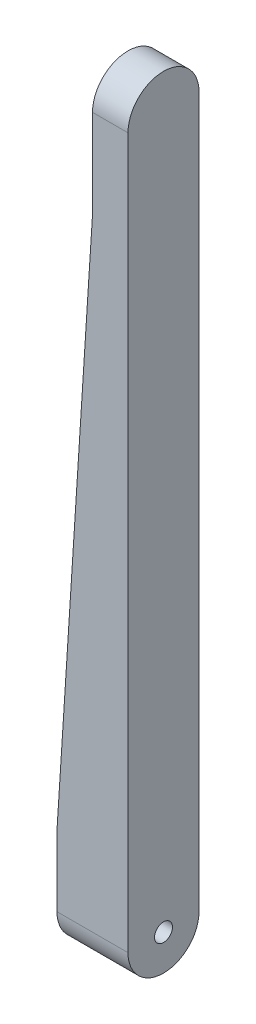
ISO-10303-21;
HEADER;
FILE_DESCRIPTION(('STEP AP214'),'2;1');
FILE_NAME('part.step','',(''),(''),'','','');
FILE_SCHEMA(('AUTOMOTIVE_DESIGN { 1 0 10303 214 1 1 1 1 }'));
ENDSEC;
DATA;
#1=APPLICATION_CONTEXT('core data for automotive mechanical design processes');
#2=APPLICATION_PROTOCOL_DEFINITION('international standard','automotive_design',2000,#1);
#3=PRODUCT_CONTEXT('',#1,'mechanical');
#4=PRODUCT('Part','Part','',(#3));
#5=PRODUCT_RELATED_PRODUCT_CATEGORY('part','',(#4));
#6=PRODUCT_DEFINITION_FORMATION('','',#4);
#7=PRODUCT_DEFINITION_CONTEXT('part definition',#1,'design');
#8=PRODUCT_DEFINITION('design','',#6,#7);
#9=PRODUCT_DEFINITION_SHAPE('','',#8);
#10=(LENGTH_UNIT() NAMED_UNIT(*) SI_UNIT(.MILLI.,.METRE.));
#11=(NAMED_UNIT(*) PLANE_ANGLE_UNIT() SI_UNIT($,.RADIAN.));
#12=(NAMED_UNIT(*) SI_UNIT($,.STERADIAN.) SOLID_ANGLE_UNIT());
#13=UNCERTAINTY_MEASURE_WITH_UNIT(LENGTH_MEASURE(1.E-05),#10,'distance_accuracy_value','');
#14=(GEOMETRIC_REPRESENTATION_CONTEXT(3) GLOBAL_UNCERTAINTY_ASSIGNED_CONTEXT((#13)) GLOBAL_UNIT_ASSIGNED_CONTEXT((#10,
#11,#12)) REPRESENTATION_CONTEXT('',''));
#15=CARTESIAN_POINT('',(0.,0.,0.));
#16=DIRECTION('',(0.,0.,1.));
#17=DIRECTION('',(1.,0.,0.));
#18=AXIS2_PLACEMENT_3D('',#15,#16,#17);
#19=CARTESIAN_POINT('',(9.99999999999999,438.,0.));
#20=DIRECTION('',(1.,0.,0.));
#21=DIRECTION('',(0.,0.,-1.));
#22=AXIS2_PLACEMENT_3D('',#19,#20,#21);
#23=CYLINDRICAL_SURFACE('',#22,20.);
#24=DIRECTION('',(1.,0.,0.));
#25=VECTOR('',#24,1.);
#26=CARTESIAN_POINT('',(20.,438.,20.));
#27=LINE('',#26,#25);
#28=CARTESIAN_POINT('',(20.,438.,20.));
#29=VERTEX_POINT('',#28);
#30=CARTESIAN_POINT('',(60.,438.,20.));
#31=VERTEX_POINT('',#30);
#32=EDGE_CURVE('E87',#29,#31,#27,.T.);
#33=ORIENTED_EDGE('',*,*,#32,.F.);
#34=CARTESIAN_POINT('',(20.,438.,0.));
#35=DIRECTION('',(-1.,0.,0.));
#36=DIRECTION('',(0.,0.,1.));
#37=AXIS2_PLACEMENT_3D('',#34,#35,#36);
#38=CIRCLE('',#37,20.);
#39=CARTESIAN_POINT('',(20.,438.,-20.));
#40=VERTEX_POINT('',#39);
#41=EDGE_CURVE('E91',#29,#40,#38,.F.);
#42=ORIENTED_EDGE('',*,*,#41,.T.);
#43=DIRECTION('',(1.,0.,0.));
#44=VECTOR('',#43,1.);
#45=CARTESIAN_POINT('',(20.,438.,-20.));
#46=LINE('',#45,#44);
#47=CARTESIAN_POINT('',(60.,438.,-20.));
#48=VERTEX_POINT('',#47);
#49=EDGE_CURVE('E96',#40,#48,#46,.T.);
#50=ORIENTED_EDGE('',*,*,#49,.T.);
#51=CARTESIAN_POINT('',(60.,438.,0.));
#52=DIRECTION('',(1.,0.,0.));
#53=DIRECTION('',(0.,0.,-1.));
#54=AXIS2_PLACEMENT_3D('',#51,#52,#53);
#55=CIRCLE('',#54,20.);
#56=EDGE_CURVE('E11',#31,#48,#55,.T.);
#57=ORIENTED_EDGE('',*,*,#56,.F.);
#58=EDGE_LOOP('',(#33,#42,#50,#57));
#59=FACE_BOUND('',#58,.T.);
#60=ADVANCED_FACE('F35',(#59),#23,.T.);
#61=CARTESIAN_POINT('',(20.,438.,20.));
#62=DIRECTION('',(0.,0.,-1.));
#63=DIRECTION('',(-1.,0.,0.));
#64=AXIS2_PLACEMENT_3D('',#61,#62,#63);
#65=PLANE('',#64);
#66=DIRECTION('',(0.,1.,0.));
#67=VECTOR('',#66,1.);
#68=CARTESIAN_POINT('',(60.,438.,20.));
#69=LINE('',#68,#67);
#70=CARTESIAN_POINT('',(60.,838.,20.));
#71=VERTEX_POINT('',#70);
#72=EDGE_CURVE('E181',#31,#71,#69,.T.);
#73=ORIENTED_EDGE('',*,*,#72,.T.);
#74=DIRECTION('',(-1.,0.,0.));
#75=VECTOR('',#74,1.);
#76=CARTESIAN_POINT('',(60.,838.,20.));
#77=LINE('',#76,#75);
#78=CARTESIAN_POINT('',(40.,838.,20.));
#79=VERTEX_POINT('',#78);
#80=EDGE_CURVE('E117',#71,#79,#77,.T.);
#81=ORIENTED_EDGE('',*,*,#80,.T.);
#82=DIRECTION('',(0.,-1.,0.));
#83=VECTOR('',#82,1.);
#84=CARTESIAN_POINT('',(40.,838.,20.));
#85=LINE('',#84,#83);
#86=CARTESIAN_POINT('',(40.,788.,20.));
#87=VERTEX_POINT('',#86);
#88=EDGE_CURVE('E122',#79,#87,#85,.T.);
#89=ORIENTED_EDGE('',*,*,#88,.T.);
#90=DIRECTION('',(0.064382277997965,0.997925308968458,0.));
#91=VECTOR('',#90,1.);
#92=CARTESIAN_POINT('',(20.,478.,20.));
#93=LINE('',#92,#91);
#94=CARTESIAN_POINT('',(20.,478.000000000001,20.));
#95=VERTEX_POINT('',#94);
#96=EDGE_CURVE('E102',#95,#87,#93,.T.);
#97=ORIENTED_EDGE('',*,*,#96,.F.);
#98=DIRECTION('',(0.,1.,0.));
#99=VECTOR('',#98,1.);
#100=CARTESIAN_POINT('',(20.,438.,20.));
#101=LINE('',#100,#99);
#102=EDGE_CURVE('E99',#29,#95,#101,.T.);
#103=ORIENTED_EDGE('',*,*,#102,.F.);
#104=ORIENTED_EDGE('',*,*,#32,.T.);
#105=EDGE_LOOP('',(#73,#81,#89,#97,#103,#104));
#106=FACE_BOUND('',#105,.T.);
#107=ADVANCED_FACE('F100',(#106),#65,.F.);
#108=CARTESIAN_POINT('',(20.,438.,-20.));
#109=DIRECTION('',(0.,0.,-1.));
#110=DIRECTION('',(-1.,0.,0.));
#111=AXIS2_PLACEMENT_3D('',#108,#109,#110);
#112=PLANE('',#111);
#113=DIRECTION('',(0.,1.,0.));
#114=VECTOR('',#113,1.);
#115=CARTESIAN_POINT('',(60.,438.,-20.));
#116=LINE('',#115,#114);
#117=CARTESIAN_POINT('',(60.,838.,-20.));
#118=VERTEX_POINT('',#117);
#119=EDGE_CURVE('E105',#48,#118,#116,.T.);
#120=ORIENTED_EDGE('',*,*,#119,.F.);
#121=ORIENTED_EDGE('',*,*,#49,.F.);
#122=DIRECTION('',(0.,1.,0.));
#123=VECTOR('',#122,1.);
#124=CARTESIAN_POINT('',(20.,438.,-20.));
#125=LINE('',#124,#123);
#126=CARTESIAN_POINT('',(20.,478.000000000001,-20.));
#127=VERTEX_POINT('',#126);
#128=EDGE_CURVE('E95',#40,#127,#125,.T.);
#129=ORIENTED_EDGE('',*,*,#128,.T.);
#130=DIRECTION('',(0.064382277997965,0.997925308968458,0.));
#131=VECTOR('',#130,1.);
#132=CARTESIAN_POINT('',(20.,478.,-20.));
#133=LINE('',#132,#131);
#134=CARTESIAN_POINT('',(40.,788.,-20.));
#135=VERTEX_POINT('',#134);
#136=EDGE_CURVE('E123',#127,#135,#133,.T.);
#137=ORIENTED_EDGE('',*,*,#136,.T.);
#138=DIRECTION('',(0.,-1.,0.));
#139=VECTOR('',#138,1.);
#140=CARTESIAN_POINT('',(40.,838.,-20.));
#141=LINE('',#140,#139);
#142=CARTESIAN_POINT('',(40.,838.,-20.));
#143=VERTEX_POINT('',#142);
#144=EDGE_CURVE('E130',#143,#135,#141,.T.);
#145=ORIENTED_EDGE('',*,*,#144,.F.);
#146=DIRECTION('',(-1.,0.,0.));
#147=VECTOR('',#146,1.);
#148=CARTESIAN_POINT('',(60.,838.,-20.));
#149=LINE('',#148,#147);
#150=EDGE_CURVE('E55',#118,#143,#149,.T.);
#151=ORIENTED_EDGE('',*,*,#150,.F.);
#152=EDGE_LOOP('',(#120,#121,#129,#137,#145,#151));
#153=FACE_BOUND('',#152,.T.);
#154=ADVANCED_FACE('F188',(#153),#112,.T.);
#155=CARTESIAN_POINT('',(60.,0.,0.));
#156=DIRECTION('',(-1.,0.,0.));
#157=DIRECTION('',(0.,0.,1.));
#158=AXIS2_PLACEMENT_3D('',#155,#156,#157);
#159=PLANE('',#158);
#160=CARTESIAN_POINT('',(60.,438.,0.));
#161=DIRECTION('',(-1.,0.,0.));
#162=DIRECTION('',(0.,0.,1.));
#163=AXIS2_PLACEMENT_3D('',#160,#161,#162);
#164=CIRCLE('',#163,5.05000000000001);
#165=CARTESIAN_POINT('',(60.,438.,5.05000000000001));
#166=VERTEX_POINT('',#165);
#167=EDGE_CURVE('E113',#166,#166,#164,.T.);
#168=ORIENTED_EDGE('',*,*,#167,.T.);
#169=EDGE_LOOP('',(#168));
#170=FACE_BOUND('',#169,.T.);
#171=ORIENTED_EDGE('',*,*,#72,.F.);
#172=ORIENTED_EDGE('',*,*,#56,.T.);
#173=ORIENTED_EDGE('',*,*,#119,.T.);
#174=CARTESIAN_POINT('',(60.,838.,0.));
#175=DIRECTION('',(1.,0.,0.));
#176=DIRECTION('',(0.,0.,-1.));
#177=AXIS2_PLACEMENT_3D('',#174,#175,#176);
#178=CIRCLE('',#177,20.);
#179=EDGE_CURVE('E43',#118,#71,#178,.T.);
#180=ORIENTED_EDGE('',*,*,#179,.T.);
#181=EDGE_LOOP('',(#171,#172,#173,#180));
#182=FACE_BOUND('',#181,.T.);
#183=ADVANCED_FACE('F153',(#170,#182),#159,.F.);
#184=CARTESIAN_POINT('',(-10.7937823834197,0.696373056994819,0.));
#185=DIRECTION('',(0.997925308968458,-0.064382277997965,0.));
#186=DIRECTION('',(0.064382277997965,0.997925308968458,0.));
#187=AXIS2_PLACEMENT_3D('',#184,#185,#186);
#188=PLANE('',#187);
#189=ORIENTED_EDGE('',*,*,#96,.T.);
#190=DIRECTION('',(0.,0.,1.));
#191=VECTOR('',#190,1.);
#192=CARTESIAN_POINT('',(40.,788.,-20.));
#193=LINE('',#192,#191);
#194=EDGE_CURVE('E126',#135,#87,#193,.T.);
#195=ORIENTED_EDGE('',*,*,#194,.F.);
#196=ORIENTED_EDGE('',*,*,#136,.F.);
#197=DIRECTION('',(0.,0.,1.));
#198=VECTOR('',#197,1.);
#199=CARTESIAN_POINT('',(20.,478.,0.));
#200=LINE('',#199,#198);
#201=EDGE_CURVE('E106',#95,#127,#200,.F.);
#202=ORIENTED_EDGE('',*,*,#201,.F.);
#203=EDGE_LOOP('',(#189,#195,#196,#202));
#204=FACE_BOUND('',#203,.T.);
#205=ADVANCED_FACE('F142',(#204),#188,.F.);
#206=CARTESIAN_POINT('',(40.,838.,-20.));
#207=DIRECTION('',(1.,0.,0.));
#208=DIRECTION('',(0.,0.,-1.));
#209=AXIS2_PLACEMENT_3D('',#206,#207,#208);
#210=PLANE('',#209);
#211=ORIENTED_EDGE('',*,*,#88,.F.);
#212=CARTESIAN_POINT('',(40.,838.,0.));
#213=DIRECTION('',(1.,0.,0.));
#214=DIRECTION('',(0.,0.,-1.));
#215=AXIS2_PLACEMENT_3D('',#212,#213,#214);
#216=CIRCLE('',#215,20.);
#217=EDGE_CURVE('E115',#143,#79,#216,.T.);
#218=ORIENTED_EDGE('',*,*,#217,.F.);
#219=ORIENTED_EDGE('',*,*,#144,.T.);
#220=ORIENTED_EDGE('',*,*,#194,.T.);
#221=EDGE_LOOP('',(#211,#218,#219,#220));
#222=FACE_BOUND('',#221,.T.);
#223=ADVANCED_FACE('F152',(#222),#210,.F.);
#224=CARTESIAN_POINT('',(40.,838.,0.));
#225=DIRECTION('',(1.,0.,0.));
#226=DIRECTION('',(0.,0.,-1.));
#227=AXIS2_PLACEMENT_3D('',#224,#225,#226);
#228=CYLINDRICAL_SURFACE('',#227,20.);
#229=ORIENTED_EDGE('',*,*,#150,.T.);
#230=ORIENTED_EDGE('',*,*,#217,.T.);
#231=ORIENTED_EDGE('',*,*,#80,.F.);
#232=ORIENTED_EDGE('',*,*,#179,.F.);
#233=EDGE_LOOP('',(#229,#230,#231,#232));
#234=FACE_BOUND('',#233,.T.);
#235=ADVANCED_FACE('F158',(#234),#228,.T.);
#236=CARTESIAN_POINT('',(20.,438.,20.));
#237=DIRECTION('',(-1.,0.,0.));
#238=DIRECTION('',(0.,0.,1.));
#239=AXIS2_PLACEMENT_3D('',#236,#237,#238);
#240=PLANE('',#239);
#241=CARTESIAN_POINT('',(20.,438.,0.));
#242=DIRECTION('',(-1.,0.,0.));
#243=DIRECTION('',(0.,0.,1.));
#244=AXIS2_PLACEMENT_3D('',#241,#242,#243);
#245=CIRCLE('',#244,5.05000000000001);
#246=CARTESIAN_POINT('',(20.,438.,5.05000000000001));
#247=VERTEX_POINT('',#246);
#248=EDGE_CURVE('E38',#247,#247,#245,.T.);
#249=ORIENTED_EDGE('',*,*,#248,.F.);
#250=EDGE_LOOP('',(#249));
#251=FACE_BOUND('',#250,.T.);
#252=ORIENTED_EDGE('',*,*,#41,.F.);
#253=ORIENTED_EDGE('',*,*,#102,.T.);
#254=ORIENTED_EDGE('',*,*,#201,.T.);
#255=ORIENTED_EDGE('',*,*,#128,.F.);
#256=EDGE_LOOP('',(#252,#253,#254,#255));
#257=FACE_BOUND('',#256,.T.);
#258=ADVANCED_FACE('F109',(#251,#257),#240,.T.);
#259=CARTESIAN_POINT('',(60.,438.,0.));
#260=DIRECTION('',(-1.,0.,0.));
#261=DIRECTION('',(0.,0.,1.));
#262=AXIS2_PLACEMENT_3D('',#259,#260,#261);
#263=CYLINDRICAL_SURFACE('',#262,5.05000000000001);
#264=ORIENTED_EDGE('',*,*,#248,.T.);
#265=EDGE_LOOP('',(#264));
#266=FACE_BOUND('',#265,.T.);
#267=ORIENTED_EDGE('',*,*,#167,.F.);
#268=EDGE_LOOP('',(#267));
#269=FACE_BOUND('',#268,.T.);
#270=ADVANCED_FACE('F196',(#266,#269),#263,.F.);
#271=CLOSED_SHELL('',(#60,#107,#154,#183,#205,#223,#235,#258,#270));
#272=MANIFOLD_SOLID_BREP('B2',#271);
#273=ADVANCED_BREP_SHAPE_REPRESENTATION('',(#18,#272),#14);
#274=SHAPE_DEFINITION_REPRESENTATION(#9,#273);
ENDSEC;
END-ISO-10303-21;
